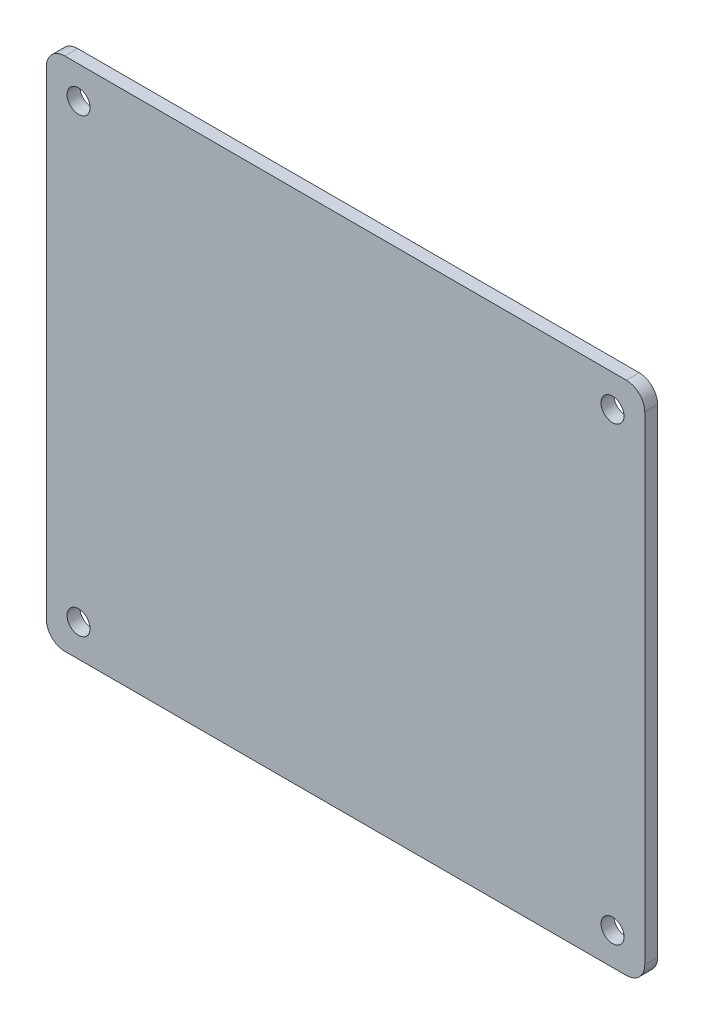
ISO-10303-21;
HEADER;
FILE_DESCRIPTION(('STEP AP214'),'2;1');
FILE_NAME('part.step','',(''),(''),'','','');
FILE_SCHEMA(('AUTOMOTIVE_DESIGN { 1 0 10303 214 1 1 1 1 }'));
ENDSEC;
DATA;
#1=APPLICATION_CONTEXT('core data for automotive mechanical design processes');
#2=APPLICATION_PROTOCOL_DEFINITION('international standard','automotive_design',2000,#1);
#3=PRODUCT_CONTEXT('',#1,'mechanical');
#4=PRODUCT('Part','Part','',(#3));
#5=PRODUCT_RELATED_PRODUCT_CATEGORY('part','',(#4));
#6=PRODUCT_DEFINITION_FORMATION('','',#4);
#7=PRODUCT_DEFINITION_CONTEXT('part definition',#1,'design');
#8=PRODUCT_DEFINITION('design','',#6,#7);
#9=PRODUCT_DEFINITION_SHAPE('','',#8);
#10=(LENGTH_UNIT() NAMED_UNIT(*) SI_UNIT(.MILLI.,.METRE.));
#11=(NAMED_UNIT(*) PLANE_ANGLE_UNIT() SI_UNIT($,.RADIAN.));
#12=(NAMED_UNIT(*) SI_UNIT($,.STERADIAN.) SOLID_ANGLE_UNIT());
#13=UNCERTAINTY_MEASURE_WITH_UNIT(LENGTH_MEASURE(1.E-05),#10,'distance_accuracy_value','');
#14=(GEOMETRIC_REPRESENTATION_CONTEXT(3) GLOBAL_UNCERTAINTY_ASSIGNED_CONTEXT((#13)) GLOBAL_UNIT_ASSIGNED_CONTEXT((#10,
#11,#12)) REPRESENTATION_CONTEXT('',''));
#15=CARTESIAN_POINT('',(0.,0.,0.));
#16=DIRECTION('',(0.,0.,1.));
#17=DIRECTION('',(1.,0.,0.));
#18=AXIS2_PLACEMENT_3D('',#15,#16,#17);
#19=CARTESIAN_POINT('',(63.,54.,1.4));
#20=DIRECTION('',(0.,0.,-1.));
#21=DIRECTION('',(-1.,0.,0.));
#22=AXIS2_PLACEMENT_3D('',#19,#20,#21);
#23=CYLINDRICAL_SURFACE('',#22,2.);
#24=CARTESIAN_POINT('',(63.,54.,1.4));
#25=DIRECTION('',(0.,0.,-1.));
#26=DIRECTION('',(-1.,0.,0.));
#27=AXIS2_PLACEMENT_3D('',#24,#25,#26);
#28=CIRCLE('',#27,2.);
#29=CARTESIAN_POINT('',(65.,54.,1.4));
#30=VERTEX_POINT('',#29);
#31=CARTESIAN_POINT('',(63.,56.,1.4));
#32=VERTEX_POINT('',#31);
#33=EDGE_CURVE('E21',#30,#32,#28,.F.);
#34=ORIENTED_EDGE('',*,*,#33,.F.);
#35=DIRECTION('',(0.,0.,1.));
#36=VECTOR('',#35,1.);
#37=CARTESIAN_POINT('',(65.,54.,0.7));
#38=LINE('',#37,#36);
#39=CARTESIAN_POINT('',(65.,54.,0.));
#40=VERTEX_POINT('',#39);
#41=EDGE_CURVE('E132',#40,#30,#38,.T.);
#42=ORIENTED_EDGE('',*,*,#41,.F.);
#43=CARTESIAN_POINT('',(63.,54.,0.));
#44=DIRECTION('',(0.,0.,-1.));
#45=DIRECTION('',(-1.,0.,0.));
#46=AXIS2_PLACEMENT_3D('',#43,#44,#45);
#47=CIRCLE('',#46,2.);
#48=CARTESIAN_POINT('',(63.,56.,0.));
#49=VERTEX_POINT('',#48);
#50=EDGE_CURVE('E85',#49,#40,#47,.T.);
#51=ORIENTED_EDGE('',*,*,#50,.F.);
#52=DIRECTION('',(0.,0.,-1.));
#53=VECTOR('',#52,1.);
#54=CARTESIAN_POINT('',(63.,56.,0.7));
#55=LINE('',#54,#53);
#56=EDGE_CURVE('E82',#32,#49,#55,.T.);
#57=ORIENTED_EDGE('',*,*,#56,.F.);
#58=EDGE_LOOP('',(#34,#42,#51,#57));
#59=FACE_BOUND('',#58,.T.);
#60=ADVANCED_FACE('F17',(#59),#23,.T.);
#61=CARTESIAN_POINT('',(65.,1.99,-0.01));
#62=DIRECTION('',(1.,0.,0.));
#63=DIRECTION('',(0.,1.,0.));
#64=AXIS2_PLACEMENT_3D('',#61,#62,#63);
#65=PLANE('',#64);
#66=DIRECTION('',(0.,1.,0.));
#67=VECTOR('',#66,1.);
#68=CARTESIAN_POINT('',(65.,28.,1.4));
#69=LINE('',#68,#67);
#70=CARTESIAN_POINT('',(65.,2.,1.4));
#71=VERTEX_POINT('',#70);
#72=EDGE_CURVE('E100',#71,#30,#69,.T.);
#73=ORIENTED_EDGE('',*,*,#72,.F.);
#74=DIRECTION('',(0.,0.,1.));
#75=VECTOR('',#74,1.);
#76=CARTESIAN_POINT('',(65.,2.,0.7));
#77=LINE('',#76,#75);
#78=CARTESIAN_POINT('',(65.,2.,0.));
#79=VERTEX_POINT('',#78);
#80=EDGE_CURVE('E130',#79,#71,#77,.T.);
#81=ORIENTED_EDGE('',*,*,#80,.F.);
#82=DIRECTION('',(0.,-1.,0.));
#83=VECTOR('',#82,1.);
#84=CARTESIAN_POINT('',(65.,28.,0.));
#85=LINE('',#84,#83);
#86=EDGE_CURVE('E114',#40,#79,#85,.T.);
#87=ORIENTED_EDGE('',*,*,#86,.F.);
#88=ORIENTED_EDGE('',*,*,#41,.T.);
#89=EDGE_LOOP('',(#73,#81,#87,#88));
#90=FACE_BOUND('',#89,.T.);
#91=ADVANCED_FACE('F184',(#90),#65,.T.);
#92=CARTESIAN_POINT('',(63.,2.,1.4));
#93=DIRECTION('',(0.,0.,-1.));
#94=DIRECTION('',(-1.,0.,0.));
#95=AXIS2_PLACEMENT_3D('',#92,#93,#94);
#96=CYLINDRICAL_SURFACE('',#95,2.);
#97=CARTESIAN_POINT('',(63.,2.,1.4));
#98=DIRECTION('',(0.,0.,-1.));
#99=DIRECTION('',(-1.,0.,0.));
#100=AXIS2_PLACEMENT_3D('',#97,#98,#99);
#101=CIRCLE('',#100,2.);
#102=CARTESIAN_POINT('',(63.,0.,1.4));
#103=VERTEX_POINT('',#102);
#104=EDGE_CURVE('E103',#103,#71,#101,.F.);
#105=ORIENTED_EDGE('',*,*,#104,.F.);
#106=DIRECTION('',(0.,0.,1.));
#107=VECTOR('',#106,1.);
#108=CARTESIAN_POINT('',(63.,0.,0.7));
#109=LINE('',#108,#107);
#110=CARTESIAN_POINT('',(63.,0.,0.));
#111=VERTEX_POINT('',#110);
#112=EDGE_CURVE('E128',#111,#103,#109,.T.);
#113=ORIENTED_EDGE('',*,*,#112,.F.);
#114=CARTESIAN_POINT('',(63.,2.,0.));
#115=DIRECTION('',(0.,0.,-1.));
#116=DIRECTION('',(-1.,0.,0.));
#117=AXIS2_PLACEMENT_3D('',#114,#115,#116);
#118=CIRCLE('',#117,2.);
#119=EDGE_CURVE('E154',#79,#111,#118,.T.);
#120=ORIENTED_EDGE('',*,*,#119,.F.);
#121=ORIENTED_EDGE('',*,*,#80,.T.);
#122=EDGE_LOOP('',(#105,#113,#120,#121));
#123=FACE_BOUND('',#122,.T.);
#124=ADVANCED_FACE('F181',(#123),#96,.T.);
#125=CARTESIAN_POINT('',(1.99000000000001,0.,-0.01));
#126=DIRECTION('',(0.,-1.,0.));
#127=DIRECTION('',(1.,0.,0.));
#128=AXIS2_PLACEMENT_3D('',#125,#126,#127);
#129=PLANE('',#128);
#130=DIRECTION('',(1.,0.,0.));
#131=VECTOR('',#130,1.);
#132=CARTESIAN_POINT('',(32.5,0.,1.4));
#133=LINE('',#132,#131);
#134=CARTESIAN_POINT('',(2.00000000000001,0.,1.4));
#135=VERTEX_POINT('',#134);
#136=EDGE_CURVE('E110',#135,#103,#133,.T.);
#137=ORIENTED_EDGE('',*,*,#136,.F.);
#138=DIRECTION('',(0.,0.,1.));
#139=VECTOR('',#138,1.);
#140=CARTESIAN_POINT('',(2.00000000000001,0.,0.7));
#141=LINE('',#140,#139);
#142=CARTESIAN_POINT('',(2.00000000000001,0.,0.));
#143=VERTEX_POINT('',#142);
#144=EDGE_CURVE('E126',#143,#135,#141,.T.);
#145=ORIENTED_EDGE('',*,*,#144,.F.);
#146=DIRECTION('',(-1.,0.,0.));
#147=VECTOR('',#146,1.);
#148=CARTESIAN_POINT('',(32.5,0.,0.));
#149=LINE('',#148,#147);
#150=EDGE_CURVE('E153',#111,#143,#149,.T.);
#151=ORIENTED_EDGE('',*,*,#150,.F.);
#152=ORIENTED_EDGE('',*,*,#112,.T.);
#153=EDGE_LOOP('',(#137,#145,#151,#152));
#154=FACE_BOUND('',#153,.T.);
#155=ADVANCED_FACE('F176',(#154),#129,.T.);
#156=CARTESIAN_POINT('',(2.00000000000001,2.,1.4));
#157=DIRECTION('',(0.,0.,-1.));
#158=DIRECTION('',(-1.,0.,0.));
#159=AXIS2_PLACEMENT_3D('',#156,#157,#158);
#160=CYLINDRICAL_SURFACE('',#159,2.);
#161=CARTESIAN_POINT('',(2.00000000000001,2.,1.4));
#162=DIRECTION('',(0.,0.,-1.));
#163=DIRECTION('',(-1.,0.,0.));
#164=AXIS2_PLACEMENT_3D('',#161,#162,#163);
#165=CIRCLE('',#164,2.);
#166=CARTESIAN_POINT('',(0.,2.,1.4));
#167=VERTEX_POINT('',#166);
#168=EDGE_CURVE('E117',#167,#135,#165,.F.);
#169=ORIENTED_EDGE('',*,*,#168,.F.);
#170=DIRECTION('',(0.,0.,1.));
#171=VECTOR('',#170,1.);
#172=CARTESIAN_POINT('',(0.,2.,0.7));
#173=LINE('',#172,#171);
#174=CARTESIAN_POINT('',(0.,2.,0.));
#175=VERTEX_POINT('',#174);
#176=EDGE_CURVE('E124',#175,#167,#173,.T.);
#177=ORIENTED_EDGE('',*,*,#176,.F.);
#178=CARTESIAN_POINT('',(2.00000000000001,2.,0.));
#179=DIRECTION('',(0.,0.,-1.));
#180=DIRECTION('',(-1.,0.,0.));
#181=AXIS2_PLACEMENT_3D('',#178,#179,#180);
#182=CIRCLE('',#181,2.);
#183=EDGE_CURVE('E150',#143,#175,#182,.T.);
#184=ORIENTED_EDGE('',*,*,#183,.F.);
#185=ORIENTED_EDGE('',*,*,#144,.T.);
#186=EDGE_LOOP('',(#169,#177,#184,#185));
#187=FACE_BOUND('',#186,.T.);
#188=ADVANCED_FACE('F173',(#187),#160,.T.);
#189=CARTESIAN_POINT('',(0.,54.01,-0.01));
#190=DIRECTION('',(-1.,0.,0.));
#191=DIRECTION('',(0.,-1.,0.));
#192=AXIS2_PLACEMENT_3D('',#189,#190,#191);
#193=PLANE('',#192);
#194=DIRECTION('',(0.,-1.,0.));
#195=VECTOR('',#194,1.);
#196=CARTESIAN_POINT('',(0.,28.,1.4));
#197=LINE('',#196,#195);
#198=CARTESIAN_POINT('',(0.,54.,1.4));
#199=VERTEX_POINT('',#198);
#200=EDGE_CURVE('E118',#199,#167,#197,.T.);
#201=ORIENTED_EDGE('',*,*,#200,.F.);
#202=DIRECTION('',(0.,0.,1.));
#203=VECTOR('',#202,1.);
#204=CARTESIAN_POINT('',(0.,54.,0.7));
#205=LINE('',#204,#203);
#206=CARTESIAN_POINT('',(0.,54.,0.));
#207=VERTEX_POINT('',#206);
#208=EDGE_CURVE('E121',#207,#199,#205,.T.);
#209=ORIENTED_EDGE('',*,*,#208,.F.);
#210=DIRECTION('',(0.,1.,0.));
#211=VECTOR('',#210,1.);
#212=CARTESIAN_POINT('',(0.,28.,0.));
#213=LINE('',#212,#211);
#214=EDGE_CURVE('E149',#175,#207,#213,.T.);
#215=ORIENTED_EDGE('',*,*,#214,.F.);
#216=ORIENTED_EDGE('',*,*,#176,.T.);
#217=EDGE_LOOP('',(#201,#209,#215,#216));
#218=FACE_BOUND('',#217,.T.);
#219=ADVANCED_FACE('F169',(#218),#193,.T.);
#220=CARTESIAN_POINT('',(2.00000000000001,54.,1.4));
#221=DIRECTION('',(0.,0.,-1.));
#222=DIRECTION('',(-1.,0.,0.));
#223=AXIS2_PLACEMENT_3D('',#220,#221,#222);
#224=CYLINDRICAL_SURFACE('',#223,2.);
#225=CARTESIAN_POINT('',(2.00000000000001,54.,1.4));
#226=DIRECTION('',(0.,0.,-1.));
#227=DIRECTION('',(-1.,0.,0.));
#228=AXIS2_PLACEMENT_3D('',#225,#226,#227);
#229=CIRCLE('',#228,2.);
#230=CARTESIAN_POINT('',(2.,56.,1.4));
#231=VERTEX_POINT('',#230);
#232=EDGE_CURVE('E94',#231,#199,#229,.F.);
#233=ORIENTED_EDGE('',*,*,#232,.F.);
#234=DIRECTION('',(0.,0.,1.));
#235=VECTOR('',#234,1.);
#236=CARTESIAN_POINT('',(2.,56.,0.7));
#237=LINE('',#236,#235);
#238=CARTESIAN_POINT('',(2.,56.,0.));
#239=VERTEX_POINT('',#238);
#240=EDGE_CURVE('E36',#239,#231,#237,.T.);
#241=ORIENTED_EDGE('',*,*,#240,.F.);
#242=CARTESIAN_POINT('',(2.00000000000001,54.,0.));
#243=DIRECTION('',(0.,0.,-1.));
#244=DIRECTION('',(-1.,0.,0.));
#245=AXIS2_PLACEMENT_3D('',#242,#243,#244);
#246=CIRCLE('',#245,2.);
#247=EDGE_CURVE('E146',#207,#239,#246,.T.);
#248=ORIENTED_EDGE('',*,*,#247,.F.);
#249=ORIENTED_EDGE('',*,*,#208,.T.);
#250=EDGE_LOOP('',(#233,#241,#248,#249));
#251=FACE_BOUND('',#250,.T.);
#252=ADVANCED_FACE('F165',(#251),#224,.T.);
#253=CARTESIAN_POINT('',(63.01,56.,-0.01));
#254=DIRECTION('',(0.,1.,0.));
#255=DIRECTION('',(-1.,0.,0.));
#256=AXIS2_PLACEMENT_3D('',#253,#254,#255);
#257=PLANE('',#256);
#258=DIRECTION('',(-1.,0.,0.));
#259=VECTOR('',#258,1.);
#260=CARTESIAN_POINT('',(32.5,56.,1.4));
#261=LINE('',#260,#259);
#262=EDGE_CURVE('E90',#32,#231,#261,.T.);
#263=ORIENTED_EDGE('',*,*,#262,.F.);
#264=ORIENTED_EDGE('',*,*,#56,.T.);
#265=DIRECTION('',(1.,0.,0.));
#266=VECTOR('',#265,1.);
#267=CARTESIAN_POINT('',(32.5,56.,0.));
#268=LINE('',#267,#266);
#269=EDGE_CURVE('E145',#239,#49,#268,.T.);
#270=ORIENTED_EDGE('',*,*,#269,.F.);
#271=ORIENTED_EDGE('',*,*,#240,.T.);
#272=EDGE_LOOP('',(#263,#264,#270,#271));
#273=FACE_BOUND('',#272,.T.);
#274=ADVANCED_FACE('F91',(#273),#257,.T.);
#275=CARTESIAN_POINT('',(61.5,52.5,1.4));
#276=DIRECTION('',(0.,0.,-1.));
#277=DIRECTION('',(-1.,0.,0.));
#278=AXIS2_PLACEMENT_3D('',#275,#276,#277);
#279=CYLINDRICAL_SURFACE('',#278,1.25);
#280=CARTESIAN_POINT('',(61.5,52.5,0.));
#281=DIRECTION('',(0.,0.,-1.));
#282=DIRECTION('',(-1.,0.,0.));
#283=AXIS2_PLACEMENT_3D('',#280,#281,#282);
#284=CIRCLE('',#283,1.25);
#285=CARTESIAN_POINT('',(60.25,52.5,0.));
#286=VERTEX_POINT('',#285);
#287=EDGE_CURVE('E142',#286,#286,#284,.F.);
#288=ORIENTED_EDGE('',*,*,#287,.F.);
#289=EDGE_LOOP('',(#288));
#290=FACE_BOUND('',#289,.T.);
#291=CARTESIAN_POINT('',(61.5,52.5,1.4));
#292=DIRECTION('',(0.,0.,-1.));
#293=DIRECTION('',(-1.,0.,0.));
#294=AXIS2_PLACEMENT_3D('',#291,#292,#293);
#295=CIRCLE('',#294,1.25);
#296=CARTESIAN_POINT('',(60.25,52.5,1.4));
#297=VERTEX_POINT('',#296);
#298=EDGE_CURVE('E105',#297,#297,#295,.T.);
#299=ORIENTED_EDGE('',*,*,#298,.F.);
#300=EDGE_LOOP('',(#299));
#301=FACE_BOUND('',#300,.T.);
#302=ADVANCED_FACE('F208',(#290,#301),#279,.F.);
#303=CARTESIAN_POINT('',(3.5,3.50000000000001,1.4));
#304=DIRECTION('',(0.,0.,-1.));
#305=DIRECTION('',(-1.,0.,0.));
#306=AXIS2_PLACEMENT_3D('',#303,#304,#305);
#307=CYLINDRICAL_SURFACE('',#306,1.25);
#308=CARTESIAN_POINT('',(3.5,3.50000000000001,0.));
#309=DIRECTION('',(0.,0.,-1.));
#310=DIRECTION('',(-1.,0.,0.));
#311=AXIS2_PLACEMENT_3D('',#308,#309,#310);
#312=CIRCLE('',#311,1.25);
#313=CARTESIAN_POINT('',(2.25,3.50000000000001,0.));
#314=VERTEX_POINT('',#313);
#315=EDGE_CURVE('E139',#314,#314,#312,.F.);
#316=ORIENTED_EDGE('',*,*,#315,.F.);
#317=EDGE_LOOP('',(#316));
#318=FACE_BOUND('',#317,.T.);
#319=CARTESIAN_POINT('',(3.5,3.50000000000001,1.4));
#320=DIRECTION('',(0.,0.,-1.));
#321=DIRECTION('',(-1.,0.,0.));
#322=AXIS2_PLACEMENT_3D('',#319,#320,#321);
#323=CIRCLE('',#322,1.25);
#324=CARTESIAN_POINT('',(2.25,3.50000000000001,1.4));
#325=VERTEX_POINT('',#324);
#326=EDGE_CURVE('E108',#325,#325,#323,.T.);
#327=ORIENTED_EDGE('',*,*,#326,.F.);
#328=EDGE_LOOP('',(#327));
#329=FACE_BOUND('',#328,.T.);
#330=ADVANCED_FACE('F204',(#318,#329),#307,.F.);
#331=CARTESIAN_POINT('',(3.50000000000001,52.5,1.4));
#332=DIRECTION('',(0.,0.,-1.));
#333=DIRECTION('',(-1.,0.,0.));
#334=AXIS2_PLACEMENT_3D('',#331,#332,#333);
#335=CYLINDRICAL_SURFACE('',#334,1.25);
#336=CARTESIAN_POINT('',(3.50000000000001,52.5,0.));
#337=DIRECTION('',(0.,0.,-1.));
#338=DIRECTION('',(-1.,0.,0.));
#339=AXIS2_PLACEMENT_3D('',#336,#337,#338);
#340=CIRCLE('',#339,1.25);
#341=CARTESIAN_POINT('',(2.25,52.5,0.));
#342=VERTEX_POINT('',#341);
#343=EDGE_CURVE('E136',#342,#342,#340,.F.);
#344=ORIENTED_EDGE('',*,*,#343,.F.);
#345=EDGE_LOOP('',(#344));
#346=FACE_BOUND('',#345,.T.);
#347=CARTESIAN_POINT('',(3.50000000000001,52.5,1.4));
#348=DIRECTION('',(0.,0.,-1.));
#349=DIRECTION('',(-1.,0.,0.));
#350=AXIS2_PLACEMENT_3D('',#347,#348,#349);
#351=CIRCLE('',#350,1.25);
#352=CARTESIAN_POINT('',(2.25,52.5,1.4));
#353=VERTEX_POINT('',#352);
#354=EDGE_CURVE('E158',#353,#353,#351,.T.);
#355=ORIENTED_EDGE('',*,*,#354,.F.);
#356=EDGE_LOOP('',(#355));
#357=FACE_BOUND('',#356,.T.);
#358=ADVANCED_FACE('F197',(#346,#357),#335,.F.);
#359=CARTESIAN_POINT('',(-0.00999999999999891,-0.00999999999999891,1.4));
#360=DIRECTION('',(0.,0.,1.));
#361=DIRECTION('',(1.,0.,0.));
#362=AXIS2_PLACEMENT_3D('',#359,#360,#361);
#363=PLANE('',#362);
#364=ORIENTED_EDGE('',*,*,#354,.T.);
#365=EDGE_LOOP('',(#364));
#366=FACE_BOUND('',#365,.T.);
#367=ORIENTED_EDGE('',*,*,#326,.T.);
#368=EDGE_LOOP('',(#367));
#369=FACE_BOUND('',#368,.T.);
#370=ORIENTED_EDGE('',*,*,#298,.T.);
#371=EDGE_LOOP('',(#370));
#372=FACE_BOUND('',#371,.T.);
#373=CARTESIAN_POINT('',(61.5,3.5,1.4));
#374=DIRECTION('',(0.,0.,-1.));
#375=DIRECTION('',(-1.,0.,0.));
#376=AXIS2_PLACEMENT_3D('',#373,#374,#375);
#377=CIRCLE('',#376,1.25);
#378=CARTESIAN_POINT('',(60.25,3.5,1.4));
#379=VERTEX_POINT('',#378);
#380=EDGE_CURVE('E27',#379,#379,#377,.F.);
#381=ORIENTED_EDGE('',*,*,#380,.F.);
#382=EDGE_LOOP('',(#381));
#383=FACE_BOUND('',#382,.T.);
#384=ORIENTED_EDGE('',*,*,#104,.T.);
#385=ORIENTED_EDGE('',*,*,#72,.T.);
#386=ORIENTED_EDGE('',*,*,#33,.T.);
#387=ORIENTED_EDGE('',*,*,#262,.T.);
#388=ORIENTED_EDGE('',*,*,#232,.T.);
#389=ORIENTED_EDGE('',*,*,#200,.T.);
#390=ORIENTED_EDGE('',*,*,#168,.T.);
#391=ORIENTED_EDGE('',*,*,#136,.T.);
#392=EDGE_LOOP('',(#384,#385,#386,#387,#388,#389,#390,#391));
#393=FACE_BOUND('',#392,.T.);
#394=ADVANCED_FACE('F98',(#366,#369,#372,#383,#393),#363,.T.);
#395=CARTESIAN_POINT('',(65.01,-0.00999999999999891,0.));
#396=DIRECTION('',(0.,0.,-1.));
#397=DIRECTION('',(-1.,0.,0.));
#398=AXIS2_PLACEMENT_3D('',#395,#396,#397);
#399=PLANE('',#398);
#400=ORIENTED_EDGE('',*,*,#343,.T.);
#401=EDGE_LOOP('',(#400));
#402=FACE_BOUND('',#401,.T.);
#403=ORIENTED_EDGE('',*,*,#315,.T.);
#404=EDGE_LOOP('',(#403));
#405=FACE_BOUND('',#404,.T.);
#406=ORIENTED_EDGE('',*,*,#287,.T.);
#407=EDGE_LOOP('',(#406));
#408=FACE_BOUND('',#407,.T.);
#409=CARTESIAN_POINT('',(61.5,3.5,0.));
#410=DIRECTION('',(0.,0.,-1.));
#411=DIRECTION('',(-1.,0.,0.));
#412=AXIS2_PLACEMENT_3D('',#409,#410,#411);
#413=CIRCLE('',#412,1.25);
#414=CARTESIAN_POINT('',(60.25,3.5,0.));
#415=VERTEX_POINT('',#414);
#416=EDGE_CURVE('E11',#415,#415,#413,.T.);
#417=ORIENTED_EDGE('',*,*,#416,.F.);
#418=EDGE_LOOP('',(#417));
#419=FACE_BOUND('',#418,.T.);
#420=ORIENTED_EDGE('',*,*,#247,.T.);
#421=ORIENTED_EDGE('',*,*,#269,.T.);
#422=ORIENTED_EDGE('',*,*,#50,.T.);
#423=ORIENTED_EDGE('',*,*,#86,.T.);
#424=ORIENTED_EDGE('',*,*,#119,.T.);
#425=ORIENTED_EDGE('',*,*,#150,.T.);
#426=ORIENTED_EDGE('',*,*,#183,.T.);
#427=ORIENTED_EDGE('',*,*,#214,.T.);
#428=EDGE_LOOP('',(#420,#421,#422,#423,#424,#425,#426,#427));
#429=FACE_BOUND('',#428,.T.);
#430=ADVANCED_FACE('F186',(#402,#405,#408,#419,#429),#399,.T.);
#431=CARTESIAN_POINT('',(61.5,3.5,1.4));
#432=DIRECTION('',(0.,0.,-1.));
#433=DIRECTION('',(-1.,0.,0.));
#434=AXIS2_PLACEMENT_3D('',#431,#432,#433);
#435=CYLINDRICAL_SURFACE('',#434,1.25);
#436=ORIENTED_EDGE('',*,*,#416,.T.);
#437=EDGE_LOOP('',(#436));
#438=FACE_BOUND('',#437,.T.);
#439=ORIENTED_EDGE('',*,*,#380,.T.);
#440=EDGE_LOOP('',(#439));
#441=FACE_BOUND('',#440,.T.);
#442=ADVANCED_FACE('F19',(#438,#441),#435,.F.);
#443=CLOSED_SHELL('',(#60,#91,#124,#155,#188,#219,#252,#274,#302,#330,#358,#394,#430,#442));
#444=MANIFOLD_SOLID_BREP('B1',#443);
#445=ADVANCED_BREP_SHAPE_REPRESENTATION('',(#18,#444),#14);
#446=SHAPE_DEFINITION_REPRESENTATION(#9,#445);
ENDSEC;
END-ISO-10303-21;
